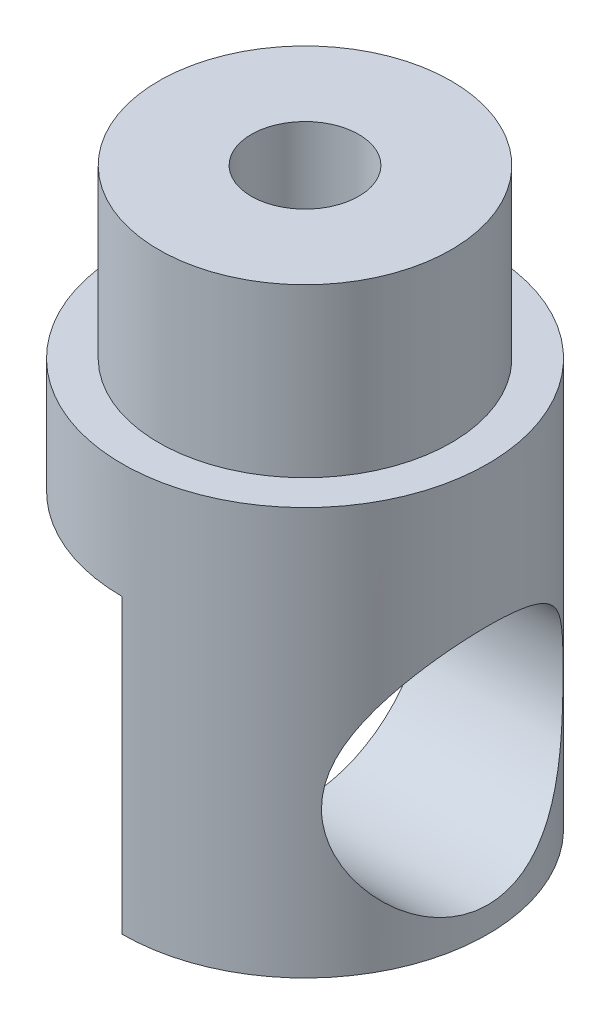
ISO-10303-21;
HEADER;
FILE_DESCRIPTION(('STEP AP214'),'2;1');
FILE_NAME('part.step','',(''),(''),'','','');
FILE_SCHEMA(('AUTOMOTIVE_DESIGN { 1 0 10303 214 1 1 1 1 }'));
ENDSEC;
DATA;
#1=APPLICATION_CONTEXT('core data for automotive mechanical design processes');
#2=APPLICATION_PROTOCOL_DEFINITION('international standard','automotive_design',2000,#1);
#3=PRODUCT_CONTEXT('',#1,'mechanical');
#4=PRODUCT('Part','Part','',(#3));
#5=PRODUCT_RELATED_PRODUCT_CATEGORY('part','',(#4));
#6=PRODUCT_DEFINITION_FORMATION('','',#4);
#7=PRODUCT_DEFINITION_CONTEXT('part definition',#1,'design');
#8=PRODUCT_DEFINITION('design','',#6,#7);
#9=PRODUCT_DEFINITION_SHAPE('','',#8);
#10=(LENGTH_UNIT() NAMED_UNIT(*) SI_UNIT(.MILLI.,.METRE.));
#11=(NAMED_UNIT(*) PLANE_ANGLE_UNIT() SI_UNIT($,.RADIAN.));
#12=(NAMED_UNIT(*) SI_UNIT($,.STERADIAN.) SOLID_ANGLE_UNIT());
#13=UNCERTAINTY_MEASURE_WITH_UNIT(LENGTH_MEASURE(1.E-05),#10,'distance_accuracy_value','');
#14=(GEOMETRIC_REPRESENTATION_CONTEXT(3) GLOBAL_UNCERTAINTY_ASSIGNED_CONTEXT((#13)) GLOBAL_UNIT_ASSIGNED_CONTEXT((#10,
#11,#12)) REPRESENTATION_CONTEXT('',''));
#15=CARTESIAN_POINT('',(0.,0.,0.));
#16=DIRECTION('',(0.,0.,1.));
#17=DIRECTION('',(1.,0.,0.));
#18=AXIS2_PLACEMENT_3D('',#15,#16,#17);
#19=CARTESIAN_POINT('',(0.,34.925,0.));
#20=DIRECTION('',(0.,-1.,0.));
#21=DIRECTION('',(0.,0.,-1.));
#22=AXIS2_PLACEMENT_3D('',#19,#20,#21);
#23=CYLINDRICAL_SURFACE('',#22,11.1125);
#24=CARTESIAN_POINT('',(8.34173849704605,8.89,7.34186999999999));
#25=CARTESIAN_POINT('',(8.34174125178824,9.06972416317023,7.34186832104932));
#26=CARTESIAN_POINT('',(8.34757354775469,9.24947254076015,7.3352565339257));
#27=CARTESIAN_POINT('',(8.37061420113186,9.60728042902002,7.30895131213686));
#28=CARTESIAN_POINT('',(8.38782477644211,9.78533960355858,7.28925532704406));
#29=CARTESIAN_POINT('',(8.43282502965931,10.1384550066829,7.23714701774038));
#30=CARTESIAN_POINT('',(8.46062800139726,10.3135071716595,7.20471871244856));
#31=CARTESIAN_POINT('',(8.52558932412581,10.6591679538025,7.12772860081442));
#32=CARTESIAN_POINT('',(8.56275243504313,10.8297742612529,7.08316062012104));
#33=CARTESIAN_POINT('',(8.68534459006537,11.3301473589604,6.93318014821748));
#34=CARTESIAN_POINT('',(8.78241044861525,11.6522384199193,6.81091330207925));
#35=CARTESIAN_POINT('',(8.9425358313089,12.1157558792293,6.59747172193773));
#36=CARTESIAN_POINT('',(8.99835705713016,12.267047893837,6.52128149554327));
#37=CARTESIAN_POINT('',(9.1135741327622,12.5630334397895,6.35926870909931));
#38=CARTESIAN_POINT('',(9.1729700842438,12.707726783252,6.27344587502325));
#39=CARTESIAN_POINT('',(9.30331397914877,13.0117349999029,6.07879387771443));
#40=CARTESIAN_POINT('',(9.37464263749045,13.1699162652817,5.9684519913356));
#41=CARTESIAN_POINT('',(9.51864091412062,13.4767493282868,5.73601132994431));
#42=CARTESIAN_POINT('',(9.5913106112392,13.6254005633978,5.61391186199659));
#43=CARTESIAN_POINT('',(9.73644546078766,13.9128651727657,5.35825612035457));
#44=CARTESIAN_POINT('',(9.80891039445927,14.0516703125844,5.2246904588936));
#45=CARTESIAN_POINT('',(9.9520803732623,14.3188136946199,4.94653704237086));
#46=CARTESIAN_POINT('',(10.022785048515,14.4471497496786,4.8019469962846));
#47=CARTESIAN_POINT('',(10.1707566584547,14.710061212335,4.48094261187304));
#48=CARTESIAN_POINT('',(10.2475385374356,14.8429545008832,4.30291876917195));
#49=CARTESIAN_POINT('',(10.3948110512727,15.0930395734918,3.93382988967207));
#50=CARTESIAN_POINT('',(10.4653045690518,15.2102385651419,3.74277090052644));
#51=CARTESIAN_POINT('',(10.5980092482381,15.4276300132173,3.34859258309808));
#52=CARTESIAN_POINT('',(10.6602248396622,15.5278315739499,3.1454797903779));
#53=CARTESIAN_POINT('',(10.7745047125767,15.709851226733,2.72844513560633));
#54=CARTESIAN_POINT('',(10.8265711183539,15.7916731662985,2.51452554731192));
#55=CARTESIAN_POINT('',(10.9137268390345,15.9275588577398,2.10182323252008));
#56=CARTESIAN_POINT('',(10.9500569444743,15.9836918239055,1.90398322431609));
#57=CARTESIAN_POINT('',(11.0122972203506,16.0793959321887,1.5027196599325));
#58=CARTESIAN_POINT('',(11.0382080849215,16.1189681775956,1.29929647667125));
#59=CARTESIAN_POINT('',(11.0788047055414,16.1808062752425,0.888938032811002));
#60=CARTESIAN_POINT('',(11.0935019165392,16.2030897886271,0.682006577526146));
#61=CARTESIAN_POINT('',(11.1112484680974,16.2299827571099,0.266510877091319));
#62=CARTESIAN_POINT('',(11.1142994049844,16.2345946344168,0.0579468596399445));
#63=CARTESIAN_POINT('',(11.109088328895,16.2267050688252,-0.327435594567768));
#64=CARTESIAN_POINT('',(11.102451273036,16.2166618049997,-0.504333054812682));
#65=CARTESIAN_POINT('',(11.0808517129325,16.1838897151976,-0.856436445570918));
#66=CARTESIAN_POINT('',(11.065889376476,16.1611611448811,-1.0316424101023));
#67=CARTESIAN_POINT('',(11.0279761825406,16.1033302415952,-1.37911051505358));
#68=CARTESIAN_POINT('',(11.0050254064298,16.0682280346601,-1.55137268543938));
#69=CARTESIAN_POINT('',(10.9516341748292,15.9861019094998,-1.891841660688));
#70=CARTESIAN_POINT('',(10.9211933966029,15.9390774775555,-2.06004829045867));
#71=CARTESIAN_POINT('',(10.8535555165069,15.8338237806317,-2.39089937378508));
#72=CARTESIAN_POINT('',(10.8163804868879,15.7756310848787,-2.55355999433042));
#73=CARTESIAN_POINT('',(10.7359259617027,15.6485438126534,-2.87310673341357));
#74=CARTESIAN_POINT('',(10.6926444575585,15.5796457141378,-3.02999093043921));
#75=CARTESIAN_POINT('',(10.5548167991652,15.3578479744214,-3.4908586107344));
#76=CARTESIAN_POINT('',(10.452236855507,15.1897677145657,-3.78529640568979));
#77=CARTESIAN_POINT('',(10.2181341100939,14.7937657289787,-4.38097403734283));
#78=CARTESIAN_POINT('',(10.0845811879612,14.5608968499237,-4.67808591529025));
#79=CARTESIAN_POINT('',(9.8087803221271,14.0545739754536,-5.23174721805259));
#80=CARTESIAN_POINT('',(9.66651921740402,13.7810576104363,-5.48823303421461));
#81=CARTESIAN_POINT('',(9.44454548243073,13.3212961462108,-5.85774141313034));
#82=CARTESIAN_POINT('',(9.36386835874668,13.1471721992205,-5.98550670195602));
#83=CARTESIAN_POINT('',(9.20583591306104,12.7873058431093,-6.22582853509052));
#84=CARTESIAN_POINT('',(9.12848132456015,12.6015608904814,-6.33838173274992));
#85=CARTESIAN_POINT('',(8.90554258940562,12.028141457927,-6.65164096282664));
#86=CARTESIAN_POINT('',(8.76861390561249,11.6233627380357,-6.82869055972669));
#87=CARTESIAN_POINT('',(8.5746053908935,10.896105694184,-7.06971489309178));
#88=CARTESIAN_POINT('',(8.50589653629828,10.5826515296698,-7.15150094517722));
#89=CARTESIAN_POINT('',(8.4279487397128,10.1027507678493,-7.24284822303579));
#90=CARTESIAN_POINT('',(8.40615553380871,9.941226469897,-7.26807174734853));
#91=CARTESIAN_POINT('',(8.37170004165881,9.615859090307,-7.30773654238489));
#92=CARTESIAN_POINT('',(8.35903780916321,9.4520159950253,-7.32217774963757));
#93=CARTESIAN_POINT('',(8.34335177541189,9.12259946506711,-7.34004606335805));
#94=CARTESIAN_POINT('',(8.34036730427459,8.95702170637342,-7.34342822668236));
#95=CARTESIAN_POINT('',(8.34427089804994,8.62613492207876,-7.33899231880977));
#96=CARTESIAN_POINT('',(8.35115899607657,8.46082589738104,-7.33117421004563));
#97=CARTESIAN_POINT('',(8.37452691899858,8.13167053463394,-7.30446911947393));
#98=CARTESIAN_POINT('',(8.39101365610442,7.96782533714376,-7.28557416089295));
#99=CARTESIAN_POINT('',(8.43289856589462,7.64293105370245,-7.23704965690062));
#100=CARTESIAN_POINT('',(8.45829690004189,7.48188201846848,-7.20741991699307));
#101=CARTESIAN_POINT('',(8.54390503729317,7.01839870379493,-7.10612459535509));
#102=CARTESIAN_POINT('',(8.61475096549599,6.72080070885361,-7.02075315442592));
#103=CARTESIAN_POINT('',(8.77768793840104,6.14406687300339,-6.81592613967613));
#104=CARTESIAN_POINT('',(8.8697860329443,5.8649371980919,-6.69645925247706));
#105=CARTESIAN_POINT('',(9.08696204431693,5.27360992170273,-6.39960567619921));
#106=CARTESIAN_POINT('',(9.2149549460561,4.96590300818616,-6.21542165070864));
#107=CARTESIAN_POINT('',(9.47827306115364,4.38211211742953,-5.8059697697916));
#108=CARTESIAN_POINT('',(9.61360705521229,4.10606729708471,-5.58065191697294));
#109=CARTESIAN_POINT('',(9.82837293878122,3.69094870961205,-5.18837824512225));
#110=CARTESIAN_POINT('',(9.90878660179446,3.54081595033417,-5.03348727394463));
#111=CARTESIAN_POINT('',(10.0665137145297,3.25400229771989,-4.71012613494497));
#112=CARTESIAN_POINT('',(10.1438266032419,3.11732383216366,-4.54165352630395));
#113=CARTESIAN_POINT('',(10.2932836401683,2.85856372591528,-4.19191103350218));
#114=CARTESIAN_POINT('',(10.3654315789973,2.73647133539654,-4.01065073244722));
#115=CARTESIAN_POINT('',(10.5027048193427,2.50795081087851,-3.63601574890936));
#116=CARTESIAN_POINT('',(10.5678320320407,2.401518411024,-3.4426443860754));
#117=CARTESIAN_POINT('',(10.6774164792836,2.22468336151644,-3.08358502639412));
#118=CARTESIAN_POINT('',(10.7234296624409,2.1512999621781,-2.91983384022222));
#119=CARTESIAN_POINT('',(10.8088121169801,2.01624135344602,-2.58590761382146));
#120=CARTESIAN_POINT('',(10.8481826235865,1.9545639670191,-2.41573377512089));
#121=CARTESIAN_POINT('',(10.9194334302576,1.84363700537053,-2.06996754778628));
#122=CARTESIAN_POINT('',(10.9513184709516,1.79437956298807,-1.89437866871887));
#123=CARTESIAN_POINT('',(11.0069158869831,1.7088683026657,-1.53877860731209));
#124=CARTESIAN_POINT('',(11.0306281348218,1.67261468759004,-1.35876735602897));
#125=CARTESIAN_POINT('',(11.0693980800157,1.61349852863041,-0.994839846782076));
#126=CARTESIAN_POINT('',(11.0844187674535,1.59069324190831,-0.810910297782004));
#127=CARTESIAN_POINT('',(11.1052752076132,1.55906020874398,-0.441330211427351));
#128=CARTESIAN_POINT('',(11.1111109492116,1.55023247922909,-0.255679671988859));
#129=CARTESIAN_POINT('',(11.1134489199987,1.54669370199653,0.115809660555967));
#130=CARTESIAN_POINT('',(11.1099513870215,1.55198229456117,0.301648448744642));
#131=CARTESIAN_POINT('',(11.0937121277991,1.57659221619245,0.671979571006002));
#132=CARTESIAN_POINT('',(11.0809707736743,1.59591298037838,0.856471958977566));
#133=CARTESIAN_POINT('',(11.0477402017853,1.64649962992,1.21015111949089));
#134=CARTESIAN_POINT('',(11.0278383416755,1.67686146860095,1.37952393838097));
#135=CARTESIAN_POINT('',(10.9807002225776,1.74913682031514,1.71480236461234));
#136=CARTESIAN_POINT('',(10.9534614701271,1.79105426066433,1.88070677251047));
#137=CARTESIAN_POINT('',(10.8922082881161,1.88593604018245,2.20797734561839));
#138=CARTESIAN_POINT('',(10.8581959175151,1.93889702270354,2.36934487292422));
#139=CARTESIAN_POINT('',(10.7840225786268,2.05534159747692,2.68683981278683));
#140=CARTESIAN_POINT('',(10.7438592214404,2.11882927884767,2.84296516055623));
#141=CARTESIAN_POINT('',(10.6554483899918,2.25997774803269,3.15873075729234));
#142=CARTESIAN_POINT('',(10.606854549058,2.33827228712203,3.31799112786564));
#143=CARTESIAN_POINT('',(10.5044623202442,2.50537214675145,3.62916117211616));
#144=CARTESIAN_POINT('',(10.4506621496632,2.59418106986729,3.78106830106691));
#145=CARTESIAN_POINT('',(10.282811953579,2.87548448676683,4.22508328188135));
#146=CARTESIAN_POINT('',(10.162289689469,3.08289084287185,4.50556266879948));
#147=CARTESIAN_POINT('',(9.96497381664558,3.43768607832987,4.9209274635413));
#148=CARTESIAN_POINT('',(9.8911387357091,3.57356789981058,5.06738481602315));
#149=CARTESIAN_POINT('',(9.74203690237244,3.85639920081568,5.3484223721951));
#150=CARTESIAN_POINT('',(9.6667703924891,4.00334681780907,5.48300456639878));
#151=CARTESIAN_POINT('',(9.51644942651939,4.30788779213215,5.73994969687833));
#152=CARTESIAN_POINT('',(9.44139517145807,4.4654890397902,5.86230340649365));
#153=CARTESIAN_POINT('',(9.29341845507983,4.790730284591,6.09417531354687));
#154=CARTESIAN_POINT('',(9.22049601664018,4.9583703894055,6.20369337327877));
#155=CARTESIAN_POINT('',(9.02100109858782,5.44394795476677,6.49310093816642));
#156=CARTESIAN_POINT('',(8.89901355164796,5.77326670600595,6.65780950042666));
#157=CARTESIAN_POINT('',(8.73659620739143,6.28808308128897,6.8678552539071));
#158=CARTESIAN_POINT('',(8.68590529206969,6.46306588748042,6.93167757937332));
#159=CARTESIAN_POINT('',(8.59313833694029,6.81949660390834,7.04635076070929));
#160=CARTESIAN_POINT('',(8.55105976801042,7.0009425977207,7.09720542577482));
#161=CARTESIAN_POINT('',(8.48658569160505,7.3229032394734,7.17407587912453));
#162=CARTESIAN_POINT('',(8.461901136184,7.46224625163285,7.20312213253507));
#163=CARTESIAN_POINT('',(8.41903409470383,7.74334708750492,7.25317928714273));
#164=CARTESIAN_POINT('',(8.40085036255626,7.88510444296881,7.27419172832781));
#165=CARTESIAN_POINT('',(8.37152727862159,8.17029498582034,7.30791968462855));
#166=CARTESIAN_POINT('',(8.36038609987554,8.31372772874215,7.32063735157793));
#167=CARTESIAN_POINT('',(8.34549153884722,8.60143526029945,7.33761211180366));
#168=CARTESIAN_POINT('',(8.34173628542229,8.74570982637648,7.34187134793274));
#169=CARTESIAN_POINT('',(8.34173849704605,8.89,7.34186999999999));
#170=B_SPLINE_CURVE_WITH_KNOTS('',3,(#24,#25,#26,#27,#28,#29,#30,#31,#32,#33,#34,#35,#36,#37,
#38,#39,#40,#41,#42,#43,#44,#45,#46,#47,#48,#49,#50,#51,#52,#53,#54,#55,#56,#57,#58,#59,#60,#61,
#62,#63,#64,#65,#66,#67,#68,#69,#70,#71,#72,#73,#74,#75,#76,#77,#78,#79,#80,#81,#82,#83,#84,#85,
#86,#87,#88,#89,#90,#91,#92,#93,#94,#95,#96,#97,#98,#99,#100,#101,#102,#103,#104,#105,#106,#107,
#108,#109,#110,#111,#112,#113,#114,#115,#116,#117,#118,#119,#120,#121,#122,#123,#124,#125,#126,
#127,#128,#129,#130,#131,#132,#133,#134,#135,#136,#137,#138,#139,#140,#141,#142,#143,#144,#145,
#146,#147,#148,#149,#150,#151,#152,#153,#154,#155,#156,#157,#158,#159,#160,#161,#162,#163,#164,
#165,#166,#167,#168,#169),.UNSPECIFIED.,.T.,.F.,(4,2,2,2,2,2,2,2,2,2,2,2,2,2,2,2,2,2,2,2,2,2,2,
2,2,2,2,2,2,2,2,2,2,2,2,2,2,2,2,2,2,2,2,2,2,2,2,2,2,2,2,2,2,2,2,2,2,2,2,2,2,2,2,2,2,2,2,2,2,2,2,
2,4),(0.,0.539001186190455,1.07810746762802,1.61789258728523,2.15795276093285,3.22666316397183,
3.76144230040843,4.29623665399704,4.91255753577603,5.52891476279679,6.14578152533494,
6.76277683283888,7.46698278255037,8.17086420910043,8.87436741805059,9.57772322097462,
10.2032853851523,10.8288058672041,11.4536865101518,12.0784814991482,12.6097578780618,
13.1410235500023,13.6722838107813,14.2035669670366,14.733139294757,15.2628862204324,
16.3216186886604,17.5185350280547,18.7173072525198,19.4081939694273,20.099232434375,
21.4775387568178,22.4667547341401,22.9609912903918,23.4552307559824,23.9514762943894,
24.4477234972764,24.9443285024811,25.4409425057845,26.3899074005986,27.3391875429682,
28.4775858496328,29.6173771838889,30.3073071409783,30.997361366172,31.6869038476131,
32.3762581452906,32.9314469630608,33.4865324278469,34.0412653967074,34.5960070192194,
35.1530937508936,35.7101811572205,36.2672543677615,36.8243051539421,37.3433832668262,
37.8626380128631,38.3817351626026,38.9010344311816,39.4524533329737,40.0040617189,
41.1070156030137,41.7454959675572,42.3838691059309,43.0227203310808,43.6615784094561,
44.8198570834511,45.3983994393473,45.9767716545758,46.4098097280229,46.8427647514627,
47.2756074128118,47.7083404041183),.UNSPECIFIED.);
#171=CARTESIAN_POINT('',(8.34173849704605,8.89,7.34186999999999));
#172=VERTEX_POINT('',#171);
#173=EDGE_CURVE('E40',#172,#172,#170,.T.);
#174=ORIENTED_EDGE('',*,*,#173,.T.);
#175=EDGE_LOOP('',(#174));
#176=FACE_BOUND('',#175,.T.);
#177=CARTESIAN_POINT('',(0.,24.765,0.));
#178=DIRECTION('',(0.,-1.,0.));
#179=DIRECTION('',(0.,0.,-1.));
#180=AXIS2_PLACEMENT_3D('',#177,#178,#179);
#181=CIRCLE('',#180,11.1125);
#182=CARTESIAN_POINT('',(0.,24.765,-11.1125));
#183=VERTEX_POINT('',#182);
#184=EDGE_CURVE('E80',#183,#183,#181,.T.);
#185=ORIENTED_EDGE('',*,*,#184,.T.);
#186=EDGE_LOOP('',(#185));
#187=FACE_BOUND('',#186,.T.);
#188=DIRECTION('',(0.,1.,0.));
#189=VECTOR('',#188,1.);
#190=CARTESIAN_POINT('',(0.,0.,-11.1125));
#191=LINE('',#190,#189);
#192=CARTESIAN_POINT('',(0.,0.,-11.1125));
#193=VERTEX_POINT('',#192);
#194=CARTESIAN_POINT('',(0.,17.78,-11.1125));
#195=VERTEX_POINT('',#194);
#196=EDGE_CURVE('E56',#193,#195,#191,.T.);
#197=ORIENTED_EDGE('',*,*,#196,.T.);
#198=CARTESIAN_POINT('',(0.,17.78,0.));
#199=DIRECTION('',(0.,1.,0.));
#200=DIRECTION('',(0.,0.,1.));
#201=AXIS2_PLACEMENT_3D('',#198,#199,#200);
#202=CIRCLE('',#201,11.1125);
#203=CARTESIAN_POINT('',(0.,17.78,11.1125));
#204=VERTEX_POINT('',#203);
#205=EDGE_CURVE('E11',#195,#204,#202,.T.);
#206=ORIENTED_EDGE('',*,*,#205,.T.);
#207=DIRECTION('',(0.,-1.,0.));
#208=VECTOR('',#207,1.);
#209=CARTESIAN_POINT('',(0.,0.,11.1125));
#210=LINE('',#209,#208);
#211=CARTESIAN_POINT('',(0.,0.,11.1125));
#212=VERTEX_POINT('',#211);
#213=EDGE_CURVE('E71',#204,#212,#210,.T.);
#214=ORIENTED_EDGE('',*,*,#213,.T.);
#215=CARTESIAN_POINT('',(0.,0.,0.));
#216=DIRECTION('',(0.,1.,0.));
#217=DIRECTION('',(0.,0.,1.));
#218=AXIS2_PLACEMENT_3D('',#215,#216,#217);
#219=CIRCLE('',#218,11.1125);
#220=EDGE_CURVE('E49',#212,#193,#219,.T.);
#221=ORIENTED_EDGE('',*,*,#220,.T.);
#222=EDGE_LOOP('',(#197,#206,#214,#221));
#223=FACE_BOUND('',#222,.T.);
#224=ADVANCED_FACE('F36',(#176,#187,#223),#23,.T.);
#225=CARTESIAN_POINT('',(0.,0.,0.));
#226=DIRECTION('',(0.,1.,0.));
#227=DIRECTION('',(0.,0.,1.));
#228=AXIS2_PLACEMENT_3D('',#225,#226,#227);
#229=PLANE('',#228);
#230=DIRECTION('',(0.,0.,-1.));
#231=VECTOR('',#230,1.);
#232=CARTESIAN_POINT('',(0.,0.,11.1125));
#233=LINE('',#232,#231);
#234=EDGE_CURVE('E68',#212,#193,#233,.T.);
#235=ORIENTED_EDGE('',*,*,#234,.T.);
#236=ORIENTED_EDGE('',*,*,#220,.F.);
#237=EDGE_LOOP('',(#235,#236));
#238=FACE_BOUND('',#237,.T.);
#239=ADVANCED_FACE('F79',(#238),#229,.F.);
#240=CARTESIAN_POINT('',(0.,24.765,0.));
#241=DIRECTION('',(0.,-1.,0.));
#242=DIRECTION('',(0.,0.,-1.));
#243=AXIS2_PLACEMENT_3D('',#240,#241,#242);
#244=PLANE('',#243);
#245=ORIENTED_EDGE('',*,*,#184,.F.);
#246=EDGE_LOOP('',(#245));
#247=FACE_BOUND('',#246,.T.);
#248=CARTESIAN_POINT('',(0.,24.765,0.));
#249=DIRECTION('',(0.,-1.,0.));
#250=DIRECTION('',(0.,0.,-1.));
#251=AXIS2_PLACEMENT_3D('',#248,#249,#250);
#252=CIRCLE('',#251,8.89);
#253=CARTESIAN_POINT('',(0.,24.765,-8.89));
#254=VERTEX_POINT('',#253);
#255=EDGE_CURVE('E83',#254,#254,#252,.T.);
#256=ORIENTED_EDGE('',*,*,#255,.T.);
#257=EDGE_LOOP('',(#256));
#258=FACE_BOUND('',#257,.T.);
#259=ADVANCED_FACE('F122',(#247,#258),#244,.F.);
#260=CARTESIAN_POINT('',(0.,24.765,0.));
#261=DIRECTION('',(0.,1.,0.));
#262=DIRECTION('',(0.,0.,1.));
#263=AXIS2_PLACEMENT_3D('',#260,#261,#262);
#264=CYLINDRICAL_SURFACE('',#263,8.89);
#265=ORIENTED_EDGE('',*,*,#255,.F.);
#266=EDGE_LOOP('',(#265));
#267=FACE_BOUND('',#266,.T.);
#268=CARTESIAN_POINT('',(0.,34.925,0.));
#269=DIRECTION('',(0.,-1.,0.));
#270=DIRECTION('',(0.,0.,-1.));
#271=AXIS2_PLACEMENT_3D('',#268,#269,#270);
#272=CIRCLE('',#271,8.89);
#273=CARTESIAN_POINT('',(0.,34.925,-8.89));
#274=VERTEX_POINT('',#273);
#275=EDGE_CURVE('E86',#274,#274,#272,.T.);
#276=ORIENTED_EDGE('',*,*,#275,.T.);
#277=EDGE_LOOP('',(#276));
#278=FACE_BOUND('',#277,.T.);
#279=ADVANCED_FACE('F126',(#267,#278),#264,.T.);
#280=CARTESIAN_POINT('',(0.,34.925,0.));
#281=DIRECTION('',(0.,1.,0.));
#282=DIRECTION('',(0.,0.,1.));
#283=AXIS2_PLACEMENT_3D('',#280,#281,#282);
#284=PLANE('',#283);
#285=CARTESIAN_POINT('',(0.,34.925,0.));
#286=DIRECTION('',(0.,1.,0.));
#287=DIRECTION('',(0.,0.,1.));
#288=AXIS2_PLACEMENT_3D('',#285,#286,#287);
#289=CIRCLE('',#288,3.26389999999999);
#290=CARTESIAN_POINT('',(0.,34.925,3.26389999999999));
#291=VERTEX_POINT('',#290);
#292=EDGE_CURVE('E94',#291,#291,#289,.T.);
#293=ORIENTED_EDGE('',*,*,#292,.F.);
#294=EDGE_LOOP('',(#293));
#295=FACE_BOUND('',#294,.T.);
#296=ORIENTED_EDGE('',*,*,#275,.F.);
#297=EDGE_LOOP('',(#296));
#298=FACE_BOUND('',#297,.T.);
#299=ADVANCED_FACE('F130',(#295,#298),#284,.T.);
#300=CARTESIAN_POINT('',(0.,22.225,0.));
#301=DIRECTION('',(0.,1.,0.));
#302=DIRECTION('',(0.,0.,1.));
#303=AXIS2_PLACEMENT_3D('',#300,#301,#302);
#304=CONICAL_SURFACE('',#303,3.2639,1.02974425867665);
#305=CARTESIAN_POINT('',(0.,20.2638510255559,0.));
#306=VERTEX_POINT('',#305);
#307=VERTEX_LOOP('',#306);
#308=FACE_BOUND('',#307,.T.);
#309=CARTESIAN_POINT('',(0.,22.225,0.));
#310=DIRECTION('',(0.,1.,0.));
#311=DIRECTION('',(0.,0.,1.));
#312=AXIS2_PLACEMENT_3D('',#309,#310,#311);
#313=CIRCLE('',#312,3.2639);
#314=CARTESIAN_POINT('',(0.,22.225,3.2639));
#315=VERTEX_POINT('',#314);
#316=EDGE_CURVE('E89',#315,#315,#313,.T.);
#317=ORIENTED_EDGE('',*,*,#316,.T.);
#318=EDGE_LOOP('',(#317));
#319=FACE_BOUND('',#318,.T.);
#320=ADVANCED_FACE('F132',(#308,#319),#304,.F.);
#321=CARTESIAN_POINT('',(0.,34.925,0.));
#322=DIRECTION('',(0.,1.,0.));
#323=DIRECTION('',(0.,0.,1.));
#324=AXIS2_PLACEMENT_3D('',#321,#322,#323);
#325=CYLINDRICAL_SURFACE('',#324,3.26389999999999);
#326=ORIENTED_EDGE('',*,*,#316,.F.);
#327=EDGE_LOOP('',(#326));
#328=FACE_BOUND('',#327,.T.);
#329=ORIENTED_EDGE('',*,*,#292,.T.);
#330=EDGE_LOOP('',(#329));
#331=FACE_BOUND('',#330,.T.);
#332=ADVANCED_FACE('F140',(#328,#331),#325,.F.);
#333=CARTESIAN_POINT('',(-25.4,17.78,11.1125));
#334=DIRECTION('',(0.,1.,0.));
#335=DIRECTION('',(0.,0.,1.));
#336=AXIS2_PLACEMENT_3D('',#333,#334,#335);
#337=PLANE('',#336);
#338=DIRECTION('',(0.,0.,1.));
#339=VECTOR('',#338,1.);
#340=CARTESIAN_POINT('',(0.,17.78,11.1125));
#341=LINE('',#340,#339);
#342=EDGE_CURVE('E97',#195,#204,#341,.T.);
#343=ORIENTED_EDGE('',*,*,#342,.T.);
#344=ORIENTED_EDGE('',*,*,#205,.F.);
#345=EDGE_LOOP('',(#343,#344));
#346=FACE_BOUND('',#345,.T.);
#347=ADVANCED_FACE('F114',(#346),#337,.F.);
#348=CARTESIAN_POINT('',(0.,0.,0.));
#349=DIRECTION('',(-1.,0.,0.));
#350=DIRECTION('',(0.,0.,1.));
#351=AXIS2_PLACEMENT_3D('',#348,#349,#350);
#352=PLANE('',#351);
#353=CARTESIAN_POINT('',(0.,8.89,0.));
#354=DIRECTION('',(-1.,0.,0.));
#355=DIRECTION('',(0.,0.,1.));
#356=AXIS2_PLACEMENT_3D('',#353,#354,#355);
#357=CIRCLE('',#356,7.34187);
#358=CARTESIAN_POINT('',(0.,8.89,7.34187));
#359=VERTEX_POINT('',#358);
#360=EDGE_CURVE('E100',#359,#359,#357,.T.);
#361=ORIENTED_EDGE('',*,*,#360,.F.);
#362=EDGE_LOOP('',(#361));
#363=FACE_BOUND('',#362,.T.);
#364=ORIENTED_EDGE('',*,*,#213,.F.);
#365=ORIENTED_EDGE('',*,*,#342,.F.);
#366=ORIENTED_EDGE('',*,*,#196,.F.);
#367=ORIENTED_EDGE('',*,*,#234,.F.);
#368=EDGE_LOOP('',(#364,#365,#366,#367));
#369=FACE_BOUND('',#368,.T.);
#370=ADVANCED_FACE('F70',(#363,#369),#352,.T.);
#371=CARTESIAN_POINT('',(0.,8.89,0.));
#372=DIRECTION('',(-1.,0.,0.));
#373=DIRECTION('',(0.,0.,1.));
#374=AXIS2_PLACEMENT_3D('',#371,#372,#373);
#375=CYLINDRICAL_SURFACE('',#374,7.34186999999999);
#376=ORIENTED_EDGE('',*,*,#360,.T.);
#377=EDGE_LOOP('',(#376));
#378=FACE_BOUND('',#377,.T.);
#379=ORIENTED_EDGE('',*,*,#173,.F.);
#380=EDGE_LOOP('',(#379));
#381=FACE_BOUND('',#380,.T.);
#382=ADVANCED_FACE('F109',(#378,#381),#375,.F.);
#383=CLOSED_SHELL('',(#224,#239,#259,#279,#299,#320,#332,#347,#370,#382));
#384=MANIFOLD_SOLID_BREP('B2',#383);
#385=ADVANCED_BREP_SHAPE_REPRESENTATION('',(#18,#384),#14);
#386=SHAPE_DEFINITION_REPRESENTATION(#9,#385);
ENDSEC;
END-ISO-10303-21;
